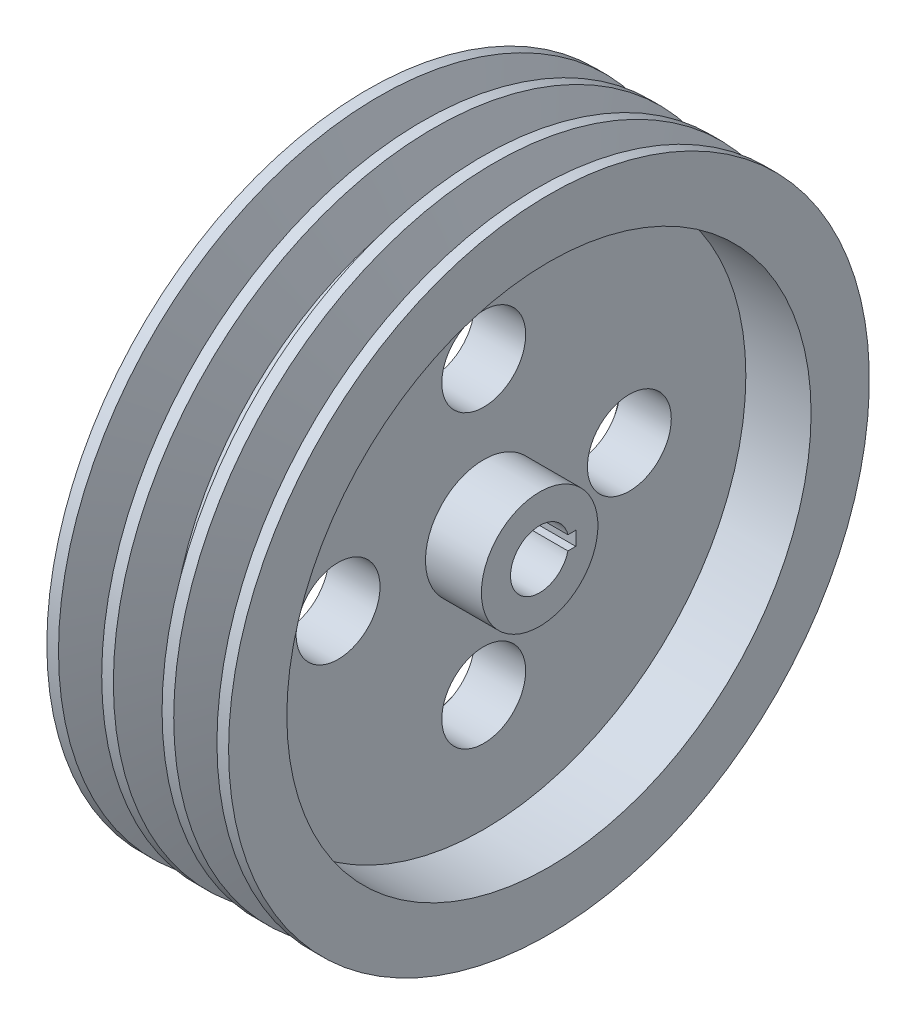
ISO-10303-21;
HEADER;
FILE_DESCRIPTION(('STEP AP214'),'2;1');
FILE_NAME('part.step','',(''),(''),'','','');
FILE_SCHEMA(('AUTOMOTIVE_DESIGN { 1 0 10303 214 1 1 1 1 }'));
ENDSEC;
DATA;
#1=APPLICATION_CONTEXT('core data for automotive mechanical design processes');
#2=APPLICATION_PROTOCOL_DEFINITION('international standard','automotive_design',2000,#1);
#3=PRODUCT_CONTEXT('',#1,'mechanical');
#4=PRODUCT('Part','Part','',(#3));
#5=PRODUCT_RELATED_PRODUCT_CATEGORY('part','',(#4));
#6=PRODUCT_DEFINITION_FORMATION('','',#4);
#7=PRODUCT_DEFINITION_CONTEXT('part definition',#1,'design');
#8=PRODUCT_DEFINITION('design','',#6,#7);
#9=PRODUCT_DEFINITION_SHAPE('','',#8);
#10=(LENGTH_UNIT() NAMED_UNIT(*) SI_UNIT(.MILLI.,.METRE.));
#11=(NAMED_UNIT(*) PLANE_ANGLE_UNIT() SI_UNIT($,.RADIAN.));
#12=(NAMED_UNIT(*) SI_UNIT($,.STERADIAN.) SOLID_ANGLE_UNIT());
#13=UNCERTAINTY_MEASURE_WITH_UNIT(LENGTH_MEASURE(1.E-05),#10,'distance_accuracy_value','');
#14=(GEOMETRIC_REPRESENTATION_CONTEXT(3) GLOBAL_UNCERTAINTY_ASSIGNED_CONTEXT((#13)) GLOBAL_UNIT_ASSIGNED_CONTEXT((#10,
#11,#12)) REPRESENTATION_CONTEXT('',''));
#15=CARTESIAN_POINT('',(0.,0.,0.));
#16=DIRECTION('',(0.,0.,1.));
#17=DIRECTION('',(1.,0.,0.));
#18=AXIS2_PLACEMENT_3D('',#15,#16,#17);
#19=CARTESIAN_POINT('',(-35.,0.,0.));
#20=DIRECTION('',(-1.,0.,0.));
#21=DIRECTION('',(0.,0.,1.));
#22=AXIS2_PLACEMENT_3D('',#19,#20,#21);
#23=CYLINDRICAL_SURFACE('',#22,137.5);
#24=CARTESIAN_POINT('',(15.4523068974331,0.,0.));
#25=DIRECTION('',(-1.,0.,0.));
#26=DIRECTION('',(0.,0.,1.));
#27=AXIS2_PLACEMENT_3D('',#24,#25,#26);
#28=CIRCLE('',#27,137.5);
#29=CARTESIAN_POINT('',(15.4523068974331,0.,137.5));
#30=VERTEX_POINT('',#29);
#31=EDGE_CURVE('E109',#30,#30,#28,.T.);
#32=ORIENTED_EDGE('',*,*,#31,.T.);
#33=EDGE_LOOP('',(#32));
#34=FACE_BOUND('',#33,.T.);
#35=CARTESIAN_POINT('',(10.4523068974331,0.,0.));
#36=DIRECTION('',(-1.,0.,0.));
#37=DIRECTION('',(0.,0.,1.));
#38=AXIS2_PLACEMENT_3D('',#35,#36,#37);
#39=CIRCLE('',#38,137.5);
#40=CARTESIAN_POINT('',(10.4523068974331,0.,137.5));
#41=VERTEX_POINT('',#40);
#42=EDGE_CURVE('E45',#41,#41,#39,.T.);
#43=ORIENTED_EDGE('',*,*,#42,.F.);
#44=EDGE_LOOP('',(#43));
#45=FACE_BOUND('',#44,.T.);
#46=ADVANCED_FACE('F38',(#34,#45),#23,.T.);
#47=CARTESIAN_POINT('',(3.90084268064155,0.,0.));
#48=DIRECTION('',(1.,0.,0.));
#49=DIRECTION('',(0.,0.,-1.));
#50=AXIS2_PLACEMENT_3D('',#47,#48,#49);
#51=CONICAL_SURFACE('',#50,119.5,1.22173047639604);
#52=ORIENTED_EDGE('',*,*,#42,.T.);
#53=EDGE_LOOP('',(#52));
#54=FACE_BOUND('',#53,.T.);
#55=CARTESIAN_POINT('',(3.90084268064155,0.,0.));
#56=DIRECTION('',(-1.,0.,0.));
#57=DIRECTION('',(0.,0.,1.));
#58=AXIS2_PLACEMENT_3D('',#55,#56,#57);
#59=CIRCLE('',#58,119.5);
#60=CARTESIAN_POINT('',(3.90084268064155,0.,119.5));
#61=VERTEX_POINT('',#60);
#62=EDGE_CURVE('E174',#61,#61,#59,.T.);
#63=ORIENTED_EDGE('',*,*,#62,.F.);
#64=EDGE_LOOP('',(#63));
#65=FACE_BOUND('',#64,.T.);
#66=ADVANCED_FACE('F179',(#54,#65),#51,.T.);
#67=CARTESIAN_POINT('',(-35.,0.,0.));
#68=DIRECTION('',(-1.,0.,0.));
#69=DIRECTION('',(0.,0.,1.));
#70=AXIS2_PLACEMENT_3D('',#67,#68,#69);
#71=CYLINDRICAL_SURFACE('',#70,119.5);
#72=ORIENTED_EDGE('',*,*,#62,.T.);
#73=EDGE_LOOP('',(#72));
#74=FACE_BOUND('',#73,.T.);
#75=CARTESIAN_POINT('',(-3.90084268064157,0.,0.));
#76=DIRECTION('',(-1.,0.,0.));
#77=DIRECTION('',(0.,0.,1.));
#78=AXIS2_PLACEMENT_3D('',#75,#76,#77);
#79=CIRCLE('',#78,119.5);
#80=CARTESIAN_POINT('',(-3.90084268064157,0.,119.5));
#81=VERTEX_POINT('',#80);
#82=EDGE_CURVE('E171',#81,#81,#79,.T.);
#83=ORIENTED_EDGE('',*,*,#82,.F.);
#84=EDGE_LOOP('',(#83));
#85=FACE_BOUND('',#84,.T.);
#86=ADVANCED_FACE('F187',(#74,#85),#71,.T.);
#87=CARTESIAN_POINT('',(-10.4523068974332,0.,0.));
#88=DIRECTION('',(-1.,0.,0.));
#89=DIRECTION('',(0.,0.,1.));
#90=AXIS2_PLACEMENT_3D('',#87,#88,#89);
#91=CONICAL_SURFACE('',#90,137.5,1.22173047639603);
#92=ORIENTED_EDGE('',*,*,#82,.T.);
#93=EDGE_LOOP('',(#92));
#94=FACE_BOUND('',#93,.T.);
#95=CARTESIAN_POINT('',(-10.4523068974332,0.,0.));
#96=DIRECTION('',(-1.,0.,0.));
#97=DIRECTION('',(0.,0.,1.));
#98=AXIS2_PLACEMENT_3D('',#95,#96,#97);
#99=CIRCLE('',#98,137.5);
#100=CARTESIAN_POINT('',(-10.4523068974332,0.,137.5));
#101=VERTEX_POINT('',#100);
#102=EDGE_CURVE('E168',#101,#101,#99,.T.);
#103=ORIENTED_EDGE('',*,*,#102,.F.);
#104=EDGE_LOOP('',(#103));
#105=FACE_BOUND('',#104,.T.);
#106=ADVANCED_FACE('F279',(#94,#105),#91,.T.);
#107=CARTESIAN_POINT('',(-35.,0.,0.));
#108=DIRECTION('',(-1.,0.,0.));
#109=DIRECTION('',(0.,0.,1.));
#110=AXIS2_PLACEMENT_3D('',#107,#108,#109);
#111=CYLINDRICAL_SURFACE('',#110,137.5);
#112=ORIENTED_EDGE('',*,*,#102,.T.);
#113=EDGE_LOOP('',(#112));
#114=FACE_BOUND('',#113,.T.);
#115=CARTESIAN_POINT('',(-15.4523068974332,0.,0.));
#116=DIRECTION('',(-1.,0.,0.));
#117=DIRECTION('',(0.,0.,1.));
#118=AXIS2_PLACEMENT_3D('',#115,#116,#117);
#119=CIRCLE('',#118,137.5);
#120=CARTESIAN_POINT('',(-15.4523068974332,0.,137.5));
#121=VERTEX_POINT('',#120);
#122=EDGE_CURVE('E165',#121,#121,#119,.T.);
#123=ORIENTED_EDGE('',*,*,#122,.F.);
#124=EDGE_LOOP('',(#123));
#125=FACE_BOUND('',#124,.T.);
#126=ADVANCED_FACE('F275',(#114,#125),#111,.T.);
#127=CARTESIAN_POINT('',(-22.0037711142248,0.,0.));
#128=DIRECTION('',(1.,0.,0.));
#129=DIRECTION('',(0.,0.,-1.));
#130=AXIS2_PLACEMENT_3D('',#127,#128,#129);
#131=CONICAL_SURFACE('',#130,119.5,1.22173047639603);
#132=ORIENTED_EDGE('',*,*,#122,.T.);
#133=EDGE_LOOP('',(#132));
#134=FACE_BOUND('',#133,.T.);
#135=CARTESIAN_POINT('',(-22.0037711142248,0.,0.));
#136=DIRECTION('',(-1.,0.,0.));
#137=DIRECTION('',(0.,0.,1.));
#138=AXIS2_PLACEMENT_3D('',#135,#136,#137);
#139=CIRCLE('',#138,119.5);
#140=CARTESIAN_POINT('',(-22.0037711142248,0.,119.5));
#141=VERTEX_POINT('',#140);
#142=EDGE_CURVE('E162',#141,#141,#139,.T.);
#143=ORIENTED_EDGE('',*,*,#142,.F.);
#144=EDGE_LOOP('',(#143));
#145=FACE_BOUND('',#144,.T.);
#146=ADVANCED_FACE('F271',(#134,#145),#131,.T.);
#147=CARTESIAN_POINT('',(-35.,0.,0.));
#148=DIRECTION('',(-1.,0.,0.));
#149=DIRECTION('',(0.,0.,1.));
#150=AXIS2_PLACEMENT_3D('',#147,#148,#149);
#151=CYLINDRICAL_SURFACE('',#150,119.5);
#152=ORIENTED_EDGE('',*,*,#142,.T.);
#153=EDGE_LOOP('',(#152));
#154=FACE_BOUND('',#153,.T.);
#155=CARTESIAN_POINT('',(-27.4485357832085,0.,0.));
#156=DIRECTION('',(-1.,0.,0.));
#157=DIRECTION('',(0.,0.,1.));
#158=AXIS2_PLACEMENT_3D('',#155,#156,#157);
#159=CIRCLE('',#158,119.5);
#160=CARTESIAN_POINT('',(-27.4485357832085,0.,119.5));
#161=VERTEX_POINT('',#160);
#162=EDGE_CURVE('E159',#161,#161,#159,.T.);
#163=ORIENTED_EDGE('',*,*,#162,.F.);
#164=EDGE_LOOP('',(#163));
#165=FACE_BOUND('',#164,.T.);
#166=ADVANCED_FACE('F267',(#154,#165),#151,.T.);
#167=CARTESIAN_POINT('',(-34.0000000000001,0.,0.));
#168=DIRECTION('',(-1.,0.,0.));
#169=DIRECTION('',(0.,0.,1.));
#170=AXIS2_PLACEMENT_3D('',#167,#168,#169);
#171=CONICAL_SURFACE('',#170,137.5,1.22173047639603);
#172=ORIENTED_EDGE('',*,*,#162,.T.);
#173=EDGE_LOOP('',(#172));
#174=FACE_BOUND('',#173,.T.);
#175=CARTESIAN_POINT('',(-34.0000000000001,0.,0.));
#176=DIRECTION('',(-1.,0.,0.));
#177=DIRECTION('',(0.,0.,1.));
#178=AXIS2_PLACEMENT_3D('',#175,#176,#177);
#179=CIRCLE('',#178,137.5);
#180=CARTESIAN_POINT('',(-34.0000000000001,0.,137.5));
#181=VERTEX_POINT('',#180);
#182=EDGE_CURVE('E156',#181,#181,#179,.T.);
#183=ORIENTED_EDGE('',*,*,#182,.F.);
#184=EDGE_LOOP('',(#183));
#185=FACE_BOUND('',#184,.T.);
#186=ADVANCED_FACE('F263',(#174,#185),#171,.T.);
#187=CARTESIAN_POINT('',(-35.,0.,0.));
#188=DIRECTION('',(-1.,0.,0.));
#189=DIRECTION('',(0.,0.,1.));
#190=AXIS2_PLACEMENT_3D('',#187,#188,#189);
#191=CYLINDRICAL_SURFACE('',#190,137.5);
#192=ORIENTED_EDGE('',*,*,#182,.T.);
#193=EDGE_LOOP('',(#192));
#194=FACE_BOUND('',#193,.T.);
#195=CARTESIAN_POINT('',(-39.0000000000001,0.,0.));
#196=DIRECTION('',(-1.,0.,0.));
#197=DIRECTION('',(0.,0.,1.));
#198=AXIS2_PLACEMENT_3D('',#195,#196,#197);
#199=CIRCLE('',#198,137.5);
#200=CARTESIAN_POINT('',(-39.0000000000001,0.,137.5));
#201=VERTEX_POINT('',#200);
#202=EDGE_CURVE('E153',#201,#201,#199,.T.);
#203=ORIENTED_EDGE('',*,*,#202,.F.);
#204=EDGE_LOOP('',(#203));
#205=FACE_BOUND('',#204,.T.);
#206=ADVANCED_FACE('F259',(#194,#205),#191,.T.);
#207=CARTESIAN_POINT('',(-39.0000000000001,0.,0.));
#208=DIRECTION('',(-1.,0.,0.));
#209=DIRECTION('',(0.,0.,1.));
#210=AXIS2_PLACEMENT_3D('',#207,#208,#209);
#211=PLANE('',#210);
#212=ORIENTED_EDGE('',*,*,#202,.T.);
#213=EDGE_LOOP('',(#212));
#214=FACE_BOUND('',#213,.T.);
#215=CARTESIAN_POINT('',(-39.0000000000001,0.,0.));
#216=DIRECTION('',(-1.,0.,0.));
#217=DIRECTION('',(0.,0.,1.));
#218=AXIS2_PLACEMENT_3D('',#215,#216,#217);
#219=CIRCLE('',#218,112.5);
#220=CARTESIAN_POINT('',(-39.0000000000001,0.,112.5));
#221=VERTEX_POINT('',#220);
#222=EDGE_CURVE('E150',#221,#221,#219,.T.);
#223=ORIENTED_EDGE('',*,*,#222,.F.);
#224=EDGE_LOOP('',(#223));
#225=FACE_BOUND('',#224,.T.);
#226=ADVANCED_FACE('F255',(#214,#225),#211,.T.);
#227=CARTESIAN_POINT('',(-35.,0.,0.));
#228=DIRECTION('',(-1.,0.,0.));
#229=DIRECTION('',(0.,0.,1.));
#230=AXIS2_PLACEMENT_3D('',#227,#228,#229);
#231=CYLINDRICAL_SURFACE('',#230,112.5);
#232=ORIENTED_EDGE('',*,*,#222,.T.);
#233=EDGE_LOOP('',(#232));
#234=FACE_BOUND('',#233,.T.);
#235=CARTESIAN_POINT('',(-11.,0.,0.));
#236=DIRECTION('',(-1.,0.,0.));
#237=DIRECTION('',(0.,0.,1.));
#238=AXIS2_PLACEMENT_3D('',#235,#236,#237);
#239=CIRCLE('',#238,112.5);
#240=CARTESIAN_POINT('',(-11.,0.,112.5));
#241=VERTEX_POINT('',#240);
#242=EDGE_CURVE('E147',#241,#241,#239,.T.);
#243=ORIENTED_EDGE('',*,*,#242,.F.);
#244=EDGE_LOOP('',(#243));
#245=FACE_BOUND('',#244,.T.);
#246=ADVANCED_FACE('F251',(#234,#245),#231,.F.);
#247=CARTESIAN_POINT('',(-11.,0.,0.));
#248=DIRECTION('',(-1.,0.,0.));
#249=DIRECTION('',(0.,0.,1.));
#250=AXIS2_PLACEMENT_3D('',#247,#248,#249);
#251=PLANE('',#250);
#252=CARTESIAN_POINT('',(-11.,62.5,0.));
#253=DIRECTION('',(-1.,0.,0.));
#254=DIRECTION('',(0.,0.,1.));
#255=AXIS2_PLACEMENT_3D('',#252,#253,#254);
#256=CIRCLE('',#255,18.);
#257=CARTESIAN_POINT('',(-11.,62.5,18.));
#258=VERTEX_POINT('',#257);
#259=EDGE_CURVE('E97',#258,#258,#256,.T.);
#260=ORIENTED_EDGE('',*,*,#259,.F.);
#261=EDGE_LOOP('',(#260));
#262=FACE_BOUND('',#261,.T.);
#263=CARTESIAN_POINT('',(-11.,1.76487577565824E-12,-62.5000000000018));
#264=DIRECTION('',(-1.,0.,0.));
#265=DIRECTION('',(0.,0.,1.));
#266=AXIS2_PLACEMENT_3D('',#263,#264,#265);
#267=CIRCLE('',#266,18.0000000000014);
#268=CARTESIAN_POINT('',(-11.,1.76487577565824E-12,-44.5000000000004));
#269=VERTEX_POINT('',#268);
#270=EDGE_CURVE('E609',#269,#269,#267,.T.);
#271=ORIENTED_EDGE('',*,*,#270,.F.);
#272=EDGE_LOOP('',(#271));
#273=FACE_BOUND('',#272,.T.);
#274=CARTESIAN_POINT('',(-11.,-62.5,-3.53261214567954E-12));
#275=DIRECTION('',(-1.,0.,0.));
#276=DIRECTION('',(0.,0.,1.));
#277=AXIS2_PLACEMENT_3D('',#274,#275,#276);
#278=CIRCLE('',#277,18.0000000000038);
#279=CARTESIAN_POINT('',(-11.,-62.5,18.0000000000003));
#280=VERTEX_POINT('',#279);
#281=EDGE_CURVE('E596',#280,#280,#278,.T.);
#282=ORIENTED_EDGE('',*,*,#281,.F.);
#283=EDGE_LOOP('',(#282));
#284=FACE_BOUND('',#283,.T.);
#285=CARTESIAN_POINT('',(-11.,-1.77252981815291E-12,62.4999999999982));
#286=DIRECTION('',(-1.,0.,0.));
#287=DIRECTION('',(0.,0.,1.));
#288=AXIS2_PLACEMENT_3D('',#285,#286,#287);
#289=CIRCLE('',#288,18.0000000000028);
#290=CARTESIAN_POINT('',(-11.,-1.77252981815291E-12,80.5000000000011));
#291=VERTEX_POINT('',#290);
#292=EDGE_CURVE('E592',#291,#291,#289,.T.);
#293=ORIENTED_EDGE('',*,*,#292,.F.);
#294=EDGE_LOOP('',(#293));
#295=FACE_BOUND('',#294,.T.);
#296=ORIENTED_EDGE('',*,*,#242,.T.);
#297=EDGE_LOOP('',(#296));
#298=FACE_BOUND('',#297,.T.);
#299=CARTESIAN_POINT('',(-11.,0.,0.));
#300=DIRECTION('',(-1.,0.,0.));
#301=DIRECTION('',(0.,0.,1.));
#302=AXIS2_PLACEMENT_3D('',#299,#300,#301);
#303=CIRCLE('',#302,25.);
#304=CARTESIAN_POINT('',(-11.,0.,25.));
#305=VERTEX_POINT('',#304);
#306=EDGE_CURVE('E144',#305,#305,#303,.T.);
#307=ORIENTED_EDGE('',*,*,#306,.F.);
#308=EDGE_LOOP('',(#307));
#309=FACE_BOUND('',#308,.T.);
#310=ADVANCED_FACE('F247',(#262,#273,#284,#295,#298,#309),#251,.T.);
#311=CARTESIAN_POINT('',(-35.,0.,0.));
#312=DIRECTION('',(-1.,0.,0.));
#313=DIRECTION('',(0.,0.,1.));
#314=AXIS2_PLACEMENT_3D('',#311,#312,#313);
#315=CYLINDRICAL_SURFACE('',#314,25.);
#316=ORIENTED_EDGE('',*,*,#306,.T.);
#317=EDGE_LOOP('',(#316));
#318=FACE_BOUND('',#317,.T.);
#319=CARTESIAN_POINT('',(-35.,0.,0.));
#320=DIRECTION('',(-1.,0.,0.));
#321=DIRECTION('',(0.,0.,1.));
#322=AXIS2_PLACEMENT_3D('',#319,#320,#321);
#323=CIRCLE('',#322,25.);
#324=CARTESIAN_POINT('',(-35.,0.,25.));
#325=VERTEX_POINT('',#324);
#326=EDGE_CURVE('E141',#325,#325,#323,.T.);
#327=ORIENTED_EDGE('',*,*,#326,.F.);
#328=EDGE_LOOP('',(#327));
#329=FACE_BOUND('',#328,.T.);
#330=ADVANCED_FACE('F243',(#318,#329),#315,.T.);
#331=CARTESIAN_POINT('',(-35.,0.,0.));
#332=DIRECTION('',(-1.,0.,0.));
#333=DIRECTION('',(0.,0.,1.));
#334=AXIS2_PLACEMENT_3D('',#331,#332,#333);
#335=PLANE('',#334);
#336=DIRECTION('',(0.,0.,-1.));
#337=VECTOR('',#336,1.);
#338=CARTESIAN_POINT('',(-35.,3.,0.));
#339=LINE('',#338,#337);
#340=CARTESIAN_POINT('',(-35.,3.,-12.1346610995116));
#341=VERTEX_POINT('',#340);
#342=CARTESIAN_POINT('',(-35.,3.,-15.5));
#343=VERTEX_POINT('',#342);
#344=EDGE_CURVE('E107',#341,#343,#339,.T.);
#345=ORIENTED_EDGE('',*,*,#344,.F.);
#346=CARTESIAN_POINT('',(-35.,0.,0.));
#347=DIRECTION('',(-1.,0.,0.));
#348=DIRECTION('',(0.,0.,1.));
#349=AXIS2_PLACEMENT_3D('',#346,#347,#348);
#350=CIRCLE('',#349,12.5);
#351=CARTESIAN_POINT('',(-35.,-3.,-12.1346610995116));
#352=VERTEX_POINT('',#351);
#353=EDGE_CURVE('E138',#352,#341,#350,.T.);
#354=ORIENTED_EDGE('',*,*,#353,.F.);
#355=DIRECTION('',(0.,0.,1.));
#356=VECTOR('',#355,1.);
#357=CARTESIAN_POINT('',(-35.,-3.,0.));
#358=LINE('',#357,#356);
#359=CARTESIAN_POINT('',(-35.,-3.,-15.5));
#360=VERTEX_POINT('',#359);
#361=EDGE_CURVE('E103',#360,#352,#358,.T.);
#362=ORIENTED_EDGE('',*,*,#361,.F.);
#363=DIRECTION('',(0.,-1.,0.));
#364=VECTOR('',#363,1.);
#365=CARTESIAN_POINT('',(-35.,0.,-15.5));
#366=LINE('',#365,#364);
#367=EDGE_CURVE('E85',#343,#360,#366,.T.);
#368=ORIENTED_EDGE('',*,*,#367,.F.);
#369=EDGE_LOOP('',(#345,#354,#362,#368));
#370=FACE_BOUND('',#369,.T.);
#371=ORIENTED_EDGE('',*,*,#326,.T.);
#372=EDGE_LOOP('',(#371));
#373=FACE_BOUND('',#372,.T.);
#374=ADVANCED_FACE('F239',(#370,#373),#335,.T.);
#375=CARTESIAN_POINT('',(-35.,0.,0.));
#376=DIRECTION('',(-1.,0.,0.));
#377=DIRECTION('',(0.,0.,1.));
#378=AXIS2_PLACEMENT_3D('',#375,#376,#377);
#379=CYLINDRICAL_SURFACE('',#378,12.5);
#380=DIRECTION('',(-1.,0.,0.));
#381=VECTOR('',#380,1.);
#382=CARTESIAN_POINT('',(-35.,3.,-12.1346610995116));
#383=LINE('',#382,#381);
#384=CARTESIAN_POINT('',(35.,3.,-12.1346610995116));
#385=VERTEX_POINT('',#384);
#386=EDGE_CURVE('E59',#385,#341,#383,.T.);
#387=ORIENTED_EDGE('',*,*,#386,.F.);
#388=CARTESIAN_POINT('',(35.,0.,0.));
#389=DIRECTION('',(-1.,0.,0.));
#390=DIRECTION('',(0.,0.,1.));
#391=AXIS2_PLACEMENT_3D('',#388,#389,#390);
#392=CIRCLE('',#391,12.5);
#393=CARTESIAN_POINT('',(35.,-3.,-12.1346610995116));
#394=VERTEX_POINT('',#393);
#395=EDGE_CURVE('E136',#394,#385,#392,.T.);
#396=ORIENTED_EDGE('',*,*,#395,.F.);
#397=DIRECTION('',(-1.,0.,0.));
#398=VECTOR('',#397,1.);
#399=CARTESIAN_POINT('',(-35.,-3.,-12.1346610995116));
#400=LINE('',#399,#398);
#401=EDGE_CURVE('E51',#352,#394,#400,.F.);
#402=ORIENTED_EDGE('',*,*,#401,.F.);
#403=ORIENTED_EDGE('',*,*,#353,.T.);
#404=EDGE_LOOP('',(#387,#396,#402,#403));
#405=FACE_BOUND('',#404,.T.);
#406=ADVANCED_FACE('F236',(#405),#379,.F.);
#407=CARTESIAN_POINT('',(35.,0.,0.));
#408=DIRECTION('',(1.,0.,0.));
#409=DIRECTION('',(0.,0.,-1.));
#410=AXIS2_PLACEMENT_3D('',#407,#408,#409);
#411=PLANE('',#410);
#412=DIRECTION('',(0.,0.,1.));
#413=VECTOR('',#412,1.);
#414=CARTESIAN_POINT('',(35.,3.,-15.5));
#415=LINE('',#414,#413);
#416=CARTESIAN_POINT('',(35.,3.,-15.5));
#417=VERTEX_POINT('',#416);
#418=EDGE_CURVE('E95',#417,#385,#415,.T.);
#419=ORIENTED_EDGE('',*,*,#418,.F.);
#420=DIRECTION('',(0.,1.,0.));
#421=VECTOR('',#420,1.);
#422=CARTESIAN_POINT('',(35.,3.,-15.5));
#423=LINE('',#422,#421);
#424=CARTESIAN_POINT('',(35.,-3.,-15.5));
#425=VERTEX_POINT('',#424);
#426=EDGE_CURVE('E82',#425,#417,#423,.T.);
#427=ORIENTED_EDGE('',*,*,#426,.F.);
#428=DIRECTION('',(0.,0.,-1.));
#429=VECTOR('',#428,1.);
#430=CARTESIAN_POINT('',(35.,-3.,0.));
#431=LINE('',#430,#429);
#432=EDGE_CURVE('E11',#394,#425,#431,.T.);
#433=ORIENTED_EDGE('',*,*,#432,.F.);
#434=ORIENTED_EDGE('',*,*,#395,.T.);
#435=EDGE_LOOP('',(#419,#427,#433,#434));
#436=FACE_BOUND('',#435,.T.);
#437=CARTESIAN_POINT('',(35.,0.,0.));
#438=DIRECTION('',(-1.,0.,0.));
#439=DIRECTION('',(0.,0.,1.));
#440=AXIS2_PLACEMENT_3D('',#437,#438,#439);
#441=CIRCLE('',#440,25.);
#442=CARTESIAN_POINT('',(35.,0.,25.));
#443=VERTEX_POINT('',#442);
#444=EDGE_CURVE('E133',#443,#443,#441,.T.);
#445=ORIENTED_EDGE('',*,*,#444,.F.);
#446=EDGE_LOOP('',(#445));
#447=FACE_BOUND('',#446,.T.);
#448=ADVANCED_FACE('F93',(#436,#447),#411,.T.);
#449=CARTESIAN_POINT('',(-35.,0.,0.));
#450=DIRECTION('',(-1.,0.,0.));
#451=DIRECTION('',(0.,0.,1.));
#452=AXIS2_PLACEMENT_3D('',#449,#450,#451);
#453=CYLINDRICAL_SURFACE('',#452,25.);
#454=ORIENTED_EDGE('',*,*,#444,.T.);
#455=EDGE_LOOP('',(#454));
#456=FACE_BOUND('',#455,.T.);
#457=CARTESIAN_POINT('',(11.,0.,0.));
#458=DIRECTION('',(-1.,0.,0.));
#459=DIRECTION('',(0.,0.,1.));
#460=AXIS2_PLACEMENT_3D('',#457,#458,#459);
#461=CIRCLE('',#460,25.);
#462=CARTESIAN_POINT('',(11.,0.,25.));
#463=VERTEX_POINT('',#462);
#464=EDGE_CURVE('E130',#463,#463,#461,.T.);
#465=ORIENTED_EDGE('',*,*,#464,.F.);
#466=EDGE_LOOP('',(#465));
#467=FACE_BOUND('',#466,.T.);
#468=ADVANCED_FACE('F229',(#456,#467),#453,.T.);
#469=CARTESIAN_POINT('',(11.,0.,0.));
#470=DIRECTION('',(1.,0.,0.));
#471=DIRECTION('',(0.,0.,-1.));
#472=AXIS2_PLACEMENT_3D('',#469,#470,#471);
#473=PLANE('',#472);
#474=CARTESIAN_POINT('',(11.,62.5,0.));
#475=DIRECTION('',(1.,0.,0.));
#476=DIRECTION('',(0.,0.,-1.));
#477=AXIS2_PLACEMENT_3D('',#474,#475,#476);
#478=CIRCLE('',#477,18.);
#479=CARTESIAN_POINT('',(11.,62.5,-18.));
#480=VERTEX_POINT('',#479);
#481=EDGE_CURVE('E591',#480,#480,#478,.T.);
#482=ORIENTED_EDGE('',*,*,#481,.F.);
#483=EDGE_LOOP('',(#482));
#484=FACE_BOUND('',#483,.T.);
#485=CARTESIAN_POINT('',(11.,1.76487577565824E-12,-62.5000000000018));
#486=DIRECTION('',(1.,0.,0.));
#487=DIRECTION('',(0.,0.,-1.));
#488=AXIS2_PLACEMENT_3D('',#485,#486,#487);
#489=CIRCLE('',#488,18.0000000000014);
#490=CARTESIAN_POINT('',(11.,1.76487577565824E-12,-80.5000000000031));
#491=VERTEX_POINT('',#490);
#492=EDGE_CURVE('E593',#491,#491,#489,.T.);
#493=ORIENTED_EDGE('',*,*,#492,.F.);
#494=EDGE_LOOP('',(#493));
#495=FACE_BOUND('',#494,.T.);
#496=CARTESIAN_POINT('',(11.,-62.5,-3.53261214567954E-12));
#497=DIRECTION('',(1.,0.,0.));
#498=DIRECTION('',(0.,0.,-1.));
#499=AXIS2_PLACEMENT_3D('',#496,#497,#498);
#500=CIRCLE('',#499,18.0000000000038);
#501=CARTESIAN_POINT('',(11.,-62.5,-18.0000000000073));
#502=VERTEX_POINT('',#501);
#503=EDGE_CURVE('E599',#502,#502,#500,.T.);
#504=ORIENTED_EDGE('',*,*,#503,.F.);
#505=EDGE_LOOP('',(#504));
#506=FACE_BOUND('',#505,.T.);
#507=CARTESIAN_POINT('',(11.,-1.77252981815291E-12,62.4999999999982));
#508=DIRECTION('',(1.,0.,0.));
#509=DIRECTION('',(0.,0.,-1.));
#510=AXIS2_PLACEMENT_3D('',#507,#508,#509);
#511=CIRCLE('',#510,18.0000000000028);
#512=CARTESIAN_POINT('',(11.,-1.77252981815291E-12,44.4999999999954));
#513=VERTEX_POINT('',#512);
#514=EDGE_CURVE('E604',#513,#513,#511,.T.);
#515=ORIENTED_EDGE('',*,*,#514,.F.);
#516=EDGE_LOOP('',(#515));
#517=FACE_BOUND('',#516,.T.);
#518=ORIENTED_EDGE('',*,*,#464,.T.);
#519=EDGE_LOOP('',(#518));
#520=FACE_BOUND('',#519,.T.);
#521=CARTESIAN_POINT('',(11.,0.,0.));
#522=DIRECTION('',(-1.,0.,0.));
#523=DIRECTION('',(0.,0.,1.));
#524=AXIS2_PLACEMENT_3D('',#521,#522,#523);
#525=CIRCLE('',#524,112.5);
#526=CARTESIAN_POINT('',(11.,0.,112.5));
#527=VERTEX_POINT('',#526);
#528=EDGE_CURVE('E127',#527,#527,#525,.T.);
#529=ORIENTED_EDGE('',*,*,#528,.F.);
#530=EDGE_LOOP('',(#529));
#531=FACE_BOUND('',#530,.T.);
#532=ADVANCED_FACE('F223',(#484,#495,#506,#517,#520,#531),#473,.T.);
#533=CARTESIAN_POINT('',(-35.,0.,0.));
#534=DIRECTION('',(-1.,0.,0.));
#535=DIRECTION('',(0.,0.,1.));
#536=AXIS2_PLACEMENT_3D('',#533,#534,#535);
#537=CYLINDRICAL_SURFACE('',#536,112.5);
#538=ORIENTED_EDGE('',*,*,#528,.T.);
#539=EDGE_LOOP('',(#538));
#540=FACE_BOUND('',#539,.T.);
#541=CARTESIAN_POINT('',(38.9999999999999,0.,0.));
#542=DIRECTION('',(-1.,0.,0.));
#543=DIRECTION('',(0.,0.,1.));
#544=AXIS2_PLACEMENT_3D('',#541,#542,#543);
#545=CIRCLE('',#544,112.5);
#546=CARTESIAN_POINT('',(38.9999999999999,0.,112.5));
#547=VERTEX_POINT('',#546);
#548=EDGE_CURVE('E124',#547,#547,#545,.T.);
#549=ORIENTED_EDGE('',*,*,#548,.F.);
#550=EDGE_LOOP('',(#549));
#551=FACE_BOUND('',#550,.T.);
#552=ADVANCED_FACE('F217',(#540,#551),#537,.F.);
#553=CARTESIAN_POINT('',(38.9999999999999,0.,0.));
#554=DIRECTION('',(1.,0.,0.));
#555=DIRECTION('',(0.,0.,-1.));
#556=AXIS2_PLACEMENT_3D('',#553,#554,#555);
#557=PLANE('',#556);
#558=ORIENTED_EDGE('',*,*,#548,.T.);
#559=EDGE_LOOP('',(#558));
#560=FACE_BOUND('',#559,.T.);
#561=CARTESIAN_POINT('',(38.9999999999999,0.,0.));
#562=DIRECTION('',(-1.,0.,0.));
#563=DIRECTION('',(0.,0.,1.));
#564=AXIS2_PLACEMENT_3D('',#561,#562,#563);
#565=CIRCLE('',#564,137.5);
#566=CARTESIAN_POINT('',(38.9999999999999,0.,137.5));
#567=VERTEX_POINT('',#566);
#568=EDGE_CURVE('E121',#567,#567,#565,.T.);
#569=ORIENTED_EDGE('',*,*,#568,.F.);
#570=EDGE_LOOP('',(#569));
#571=FACE_BOUND('',#570,.T.);
#572=ADVANCED_FACE('F212',(#560,#571),#557,.T.);
#573=CARTESIAN_POINT('',(-35.,0.,0.));
#574=DIRECTION('',(-1.,0.,0.));
#575=DIRECTION('',(0.,0.,1.));
#576=AXIS2_PLACEMENT_3D('',#573,#574,#575);
#577=CYLINDRICAL_SURFACE('',#576,137.5);
#578=CARTESIAN_POINT('',(33.9999999999999,0.,0.));
#579=DIRECTION('',(-1.,0.,0.));
#580=DIRECTION('',(0.,0.,1.));
#581=AXIS2_PLACEMENT_3D('',#578,#579,#580);
#582=CIRCLE('',#581,137.5);
#583=CARTESIAN_POINT('',(33.9999999999999,0.,137.5));
#584=VERTEX_POINT('',#583);
#585=EDGE_CURVE('E118',#584,#584,#582,.T.);
#586=ORIENTED_EDGE('',*,*,#585,.F.);
#587=EDGE_LOOP('',(#586));
#588=FACE_BOUND('',#587,.T.);
#589=ORIENTED_EDGE('',*,*,#568,.T.);
#590=EDGE_LOOP('',(#589));
#591=FACE_BOUND('',#590,.T.);
#592=ADVANCED_FACE('F206',(#588,#591),#577,.T.);
#593=CARTESIAN_POINT('',(33.9999999999999,0.,0.));
#594=DIRECTION('',(1.,0.,0.));
#595=DIRECTION('',(0.,0.,-1.));
#596=AXIS2_PLACEMENT_3D('',#593,#594,#595);
#597=CONICAL_SURFACE('',#596,137.5,1.22173047639604);
#598=CARTESIAN_POINT('',(27.4485357832084,0.,0.));
#599=DIRECTION('',(-1.,0.,0.));
#600=DIRECTION('',(0.,0.,1.));
#601=AXIS2_PLACEMENT_3D('',#598,#599,#600);
#602=CIRCLE('',#601,119.5);
#603=CARTESIAN_POINT('',(27.4485357832084,0.,119.5));
#604=VERTEX_POINT('',#603);
#605=EDGE_CURVE('E115',#604,#604,#602,.T.);
#606=ORIENTED_EDGE('',*,*,#605,.F.);
#607=EDGE_LOOP('',(#606));
#608=FACE_BOUND('',#607,.T.);
#609=ORIENTED_EDGE('',*,*,#585,.T.);
#610=EDGE_LOOP('',(#609));
#611=FACE_BOUND('',#610,.T.);
#612=ADVANCED_FACE('F200',(#608,#611),#597,.T.);
#613=CARTESIAN_POINT('',(-35.,0.,0.));
#614=DIRECTION('',(-1.,0.,0.));
#615=DIRECTION('',(0.,0.,1.));
#616=AXIS2_PLACEMENT_3D('',#613,#614,#615);
#617=CYLINDRICAL_SURFACE('',#616,119.5);
#618=CARTESIAN_POINT('',(22.0037711142247,0.,0.));
#619=DIRECTION('',(-1.,0.,0.));
#620=DIRECTION('',(0.,0.,1.));
#621=AXIS2_PLACEMENT_3D('',#618,#619,#620);
#622=CIRCLE('',#621,119.5);
#623=CARTESIAN_POINT('',(22.0037711142247,0.,119.5));
#624=VERTEX_POINT('',#623);
#625=EDGE_CURVE('E112',#624,#624,#622,.T.);
#626=ORIENTED_EDGE('',*,*,#625,.F.);
#627=EDGE_LOOP('',(#626));
#628=FACE_BOUND('',#627,.T.);
#629=ORIENTED_EDGE('',*,*,#605,.T.);
#630=EDGE_LOOP('',(#629));
#631=FACE_BOUND('',#630,.T.);
#632=ADVANCED_FACE('F194',(#628,#631),#617,.T.);
#633=CARTESIAN_POINT('',(22.0037711142247,0.,0.));
#634=DIRECTION('',(-1.,0.,0.));
#635=DIRECTION('',(0.,0.,1.));
#636=AXIS2_PLACEMENT_3D('',#633,#634,#635);
#637=CONICAL_SURFACE('',#636,119.5,1.22173047639603);
#638=ORIENTED_EDGE('',*,*,#31,.F.);
#639=EDGE_LOOP('',(#638));
#640=FACE_BOUND('',#639,.T.);
#641=ORIENTED_EDGE('',*,*,#625,.T.);
#642=EDGE_LOOP('',(#641));
#643=FACE_BOUND('',#642,.T.);
#644=ADVANCED_FACE('F190',(#640,#643),#637,.T.);
#645=CARTESIAN_POINT('',(-39.0000000000001,3.,-15.5));
#646=DIRECTION('',(0.,1.,0.));
#647=DIRECTION('',(0.,0.,1.));
#648=AXIS2_PLACEMENT_3D('',#645,#646,#647);
#649=PLANE('',#648);
#650=ORIENTED_EDGE('',*,*,#344,.T.);
#651=DIRECTION('',(1.,0.,0.));
#652=VECTOR('',#651,1.);
#653=CARTESIAN_POINT('',(-39.0000000000001,3.,-15.5));
#654=LINE('',#653,#652);
#655=EDGE_CURVE('E87',#343,#417,#654,.T.);
#656=ORIENTED_EDGE('',*,*,#655,.T.);
#657=ORIENTED_EDGE('',*,*,#418,.T.);
#658=ORIENTED_EDGE('',*,*,#386,.T.);
#659=EDGE_LOOP('',(#650,#656,#657,#658));
#660=FACE_BOUND('',#659,.T.);
#661=ADVANCED_FACE('F193',(#660),#649,.F.);
#662=CARTESIAN_POINT('',(-39.0000000000001,3.,-15.5));
#663=DIRECTION('',(0.,0.,-1.));
#664=DIRECTION('',(-1.,0.,0.));
#665=AXIS2_PLACEMENT_3D('',#662,#663,#664);
#666=PLANE('',#665);
#667=ORIENTED_EDGE('',*,*,#367,.T.);
#668=DIRECTION('',(1.,0.,0.));
#669=VECTOR('',#668,1.);
#670=CARTESIAN_POINT('',(-39.0000000000001,-3.,-15.5));
#671=LINE('',#670,#669);
#672=EDGE_CURVE('E78',#360,#425,#671,.T.);
#673=ORIENTED_EDGE('',*,*,#672,.T.);
#674=ORIENTED_EDGE('',*,*,#426,.T.);
#675=ORIENTED_EDGE('',*,*,#655,.F.);
#676=EDGE_LOOP('',(#667,#673,#674,#675));
#677=FACE_BOUND('',#676,.T.);
#678=ADVANCED_FACE('F79',(#677),#666,.F.);
#679=CARTESIAN_POINT('',(-39.0000000000001,-3.,-15.5));
#680=DIRECTION('',(0.,-1.,0.));
#681=DIRECTION('',(0.,0.,-1.));
#682=AXIS2_PLACEMENT_3D('',#679,#680,#681);
#683=PLANE('',#682);
#684=ORIENTED_EDGE('',*,*,#361,.T.);
#685=ORIENTED_EDGE('',*,*,#401,.T.);
#686=ORIENTED_EDGE('',*,*,#432,.T.);
#687=ORIENTED_EDGE('',*,*,#672,.F.);
#688=EDGE_LOOP('',(#684,#685,#686,#687));
#689=FACE_BOUND('',#688,.T.);
#690=ADVANCED_FACE('F89',(#689),#683,.F.);
#691=CARTESIAN_POINT('',(-39.0000000000001,-1.77252981815291E-12,62.4999999999982));
#692=DIRECTION('',(1.,0.,0.));
#693=DIRECTION('',(0.,0.,-1.));
#694=AXIS2_PLACEMENT_3D('',#691,#692,#693);
#695=CYLINDRICAL_SURFACE('',#694,18.0000000000028);
#696=ORIENTED_EDGE('',*,*,#292,.T.);
#697=EDGE_LOOP('',(#696));
#698=FACE_BOUND('',#697,.T.);
#699=ORIENTED_EDGE('',*,*,#514,.T.);
#700=EDGE_LOOP('',(#699));
#701=FACE_BOUND('',#700,.T.);
#702=ADVANCED_FACE('F435',(#698,#701),#695,.F.);
#703=CARTESIAN_POINT('',(-39.0000000000001,-62.5,-3.53261214567954E-12));
#704=DIRECTION('',(1.,0.,0.));
#705=DIRECTION('',(0.,0.,-1.));
#706=AXIS2_PLACEMENT_3D('',#703,#704,#705);
#707=CYLINDRICAL_SURFACE('',#706,18.0000000000038);
#708=ORIENTED_EDGE('',*,*,#281,.T.);
#709=EDGE_LOOP('',(#708));
#710=FACE_BOUND('',#709,.T.);
#711=ORIENTED_EDGE('',*,*,#503,.T.);
#712=EDGE_LOOP('',(#711));
#713=FACE_BOUND('',#712,.T.);
#714=ADVANCED_FACE('F441',(#710,#713),#707,.F.);
#715=CARTESIAN_POINT('',(-39.0000000000001,1.76487577565824E-12,-62.5000000000018));
#716=DIRECTION('',(1.,0.,0.));
#717=DIRECTION('',(0.,0.,-1.));
#718=AXIS2_PLACEMENT_3D('',#715,#716,#717);
#719=CYLINDRICAL_SURFACE('',#718,18.0000000000014);
#720=ORIENTED_EDGE('',*,*,#270,.T.);
#721=EDGE_LOOP('',(#720));
#722=FACE_BOUND('',#721,.T.);
#723=ORIENTED_EDGE('',*,*,#492,.T.);
#724=EDGE_LOOP('',(#723));
#725=FACE_BOUND('',#724,.T.);
#726=ADVANCED_FACE('F449',(#722,#725),#719,.F.);
#727=CARTESIAN_POINT('',(-39.0000000000001,62.5,0.));
#728=DIRECTION('',(1.,0.,0.));
#729=DIRECTION('',(0.,0.,-1.));
#730=AXIS2_PLACEMENT_3D('',#727,#728,#729);
#731=CYLINDRICAL_SURFACE('',#730,18.);
#732=ORIENTED_EDGE('',*,*,#259,.T.);
#733=EDGE_LOOP('',(#732));
#734=FACE_BOUND('',#733,.T.);
#735=ORIENTED_EDGE('',*,*,#481,.T.);
#736=EDGE_LOOP('',(#735));
#737=FACE_BOUND('',#736,.T.);
#738=ADVANCED_FACE('F457',(#734,#737),#731,.F.);
#739=CLOSED_SHELL('',(#46,#66,#86,#106,#126,#146,#166,#186,#206,#226,#246,#310,#330,#374,#406,
#448,#468,#532,#552,#572,#592,#612,#632,#644,#661,#678,#690,#702,#714,#726,#738));
#740=MANIFOLD_SOLID_BREP('B2',#739);
#741=ADVANCED_BREP_SHAPE_REPRESENTATION('',(#18,#740),#14);
#742=SHAPE_DEFINITION_REPRESENTATION(#9,#741);
ENDSEC;
END-ISO-10303-21;
